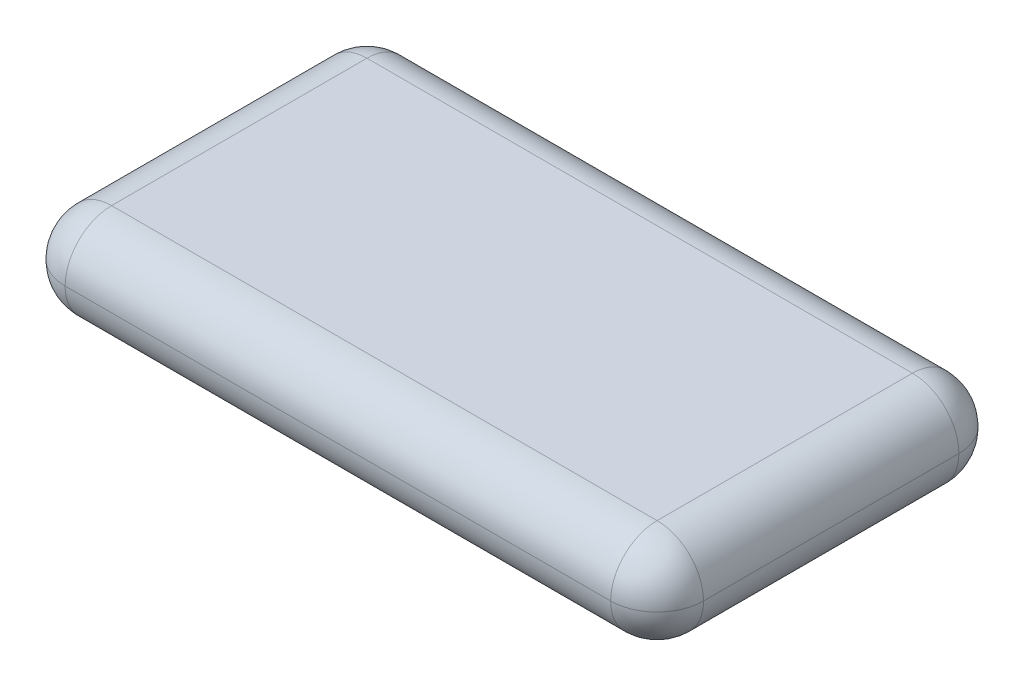
ISO-10303-21;
HEADER;
FILE_DESCRIPTION(('STEP AP214'),'2;1');
FILE_NAME('part.step','',(''),(''),'','','');
FILE_SCHEMA(('AUTOMOTIVE_DESIGN { 1 0 10303 214 1 1 1 1 }'));
ENDSEC;
DATA;
#1=APPLICATION_CONTEXT('core data for automotive mechanical design processes');
#2=APPLICATION_PROTOCOL_DEFINITION('international standard','automotive_design',2000,#1);
#3=PRODUCT_CONTEXT('',#1,'mechanical');
#4=PRODUCT('Part','Part','',(#3));
#5=PRODUCT_RELATED_PRODUCT_CATEGORY('part','',(#4));
#6=PRODUCT_DEFINITION_FORMATION('','',#4);
#7=PRODUCT_DEFINITION_CONTEXT('part definition',#1,'design');
#8=PRODUCT_DEFINITION('design','',#6,#7);
#9=PRODUCT_DEFINITION_SHAPE('','',#8);
#10=(LENGTH_UNIT() NAMED_UNIT(*) SI_UNIT(.MILLI.,.METRE.));
#11=(NAMED_UNIT(*) PLANE_ANGLE_UNIT() SI_UNIT($,.RADIAN.));
#12=(NAMED_UNIT(*) SI_UNIT($,.STERADIAN.) SOLID_ANGLE_UNIT());
#13=UNCERTAINTY_MEASURE_WITH_UNIT(LENGTH_MEASURE(1.E-05),#10,'distance_accuracy_value','');
#14=(GEOMETRIC_REPRESENTATION_CONTEXT(3) GLOBAL_UNCERTAINTY_ASSIGNED_CONTEXT((#13)) GLOBAL_UNIT_ASSIGNED_CONTEXT((#10,
#11,#12)) REPRESENTATION_CONTEXT('',''));
#15=CARTESIAN_POINT('',(0.,0.,0.));
#16=DIRECTION('',(0.,0.,1.));
#17=DIRECTION('',(1.,0.,0.));
#18=AXIS2_PLACEMENT_3D('',#15,#16,#17);
#19=CARTESIAN_POINT('',(0.,80.,0.));
#20=DIRECTION('',(0.,1.,0.));
#21=DIRECTION('',(0.,0.,1.));
#22=AXIS2_PLACEMENT_3D('',#19,#20,#21);
#23=PLANE('',#22);
#24=DIRECTION('',(0.,0.,1.));
#25=VECTOR('',#24,1.);
#26=CARTESIAN_POINT('',(-235.,80.,150.));
#27=LINE('',#26,#25);
#28=CARTESIAN_POINT('',(-235.,80.,-110.));
#29=VERTEX_POINT('',#28);
#30=CARTESIAN_POINT('',(-235.,80.,110.));
#31=VERTEX_POINT('',#30);
#32=EDGE_CURVE('E128',#29,#31,#27,.T.);
#33=ORIENTED_EDGE('',*,*,#32,.T.);
#34=DIRECTION('',(1.,0.,0.));
#35=VECTOR('',#34,1.);
#36=CARTESIAN_POINT('',(275.,80.,110.));
#37=LINE('',#36,#35);
#38=CARTESIAN_POINT('',(235.,80.,110.));
#39=VERTEX_POINT('',#38);
#40=EDGE_CURVE('E106',#31,#39,#37,.T.);
#41=ORIENTED_EDGE('',*,*,#40,.T.);
#42=DIRECTION('',(0.,0.,-1.));
#43=VECTOR('',#42,1.);
#44=CARTESIAN_POINT('',(235.,80.,-150.));
#45=LINE('',#44,#43);
#46=CARTESIAN_POINT('',(235.,80.,-110.));
#47=VERTEX_POINT('',#46);
#48=EDGE_CURVE('E117',#39,#47,#45,.T.);
#49=ORIENTED_EDGE('',*,*,#48,.T.);
#50=DIRECTION('',(-1.,0.,0.));
#51=VECTOR('',#50,1.);
#52=CARTESIAN_POINT('',(-275.,80.,-110.));
#53=LINE('',#52,#51);
#54=EDGE_CURVE('E123',#47,#29,#53,.T.);
#55=ORIENTED_EDGE('',*,*,#54,.T.);
#56=EDGE_LOOP('',(#33,#41,#49,#55));
#57=FACE_BOUND('',#56,.T.);
#58=ADVANCED_FACE('F35',(#57),#23,.T.);
#59=CARTESIAN_POINT('',(0.,0.,0.));
#60=DIRECTION('',(0.,1.,0.));
#61=DIRECTION('',(0.,0.,1.));
#62=AXIS2_PLACEMENT_3D('',#59,#60,#61);
#63=PLANE('',#62);
#64=DIRECTION('',(1.,0.,0.));
#65=VECTOR('',#64,1.);
#66=CARTESIAN_POINT('',(0.,0.,110.));
#67=LINE('',#66,#65);
#68=CARTESIAN_POINT('',(235.,0.,110.));
#69=VERTEX_POINT('',#68);
#70=CARTESIAN_POINT('',(-235.,0.,110.));
#71=VERTEX_POINT('',#70);
#72=EDGE_CURVE('E129',#69,#71,#67,.F.);
#73=ORIENTED_EDGE('',*,*,#72,.T.);
#74=DIRECTION('',(0.,0.,1.));
#75=VECTOR('',#74,1.);
#76=CARTESIAN_POINT('',(-235.,0.,0.));
#77=LINE('',#76,#75);
#78=CARTESIAN_POINT('',(-235.,0.,-110.));
#79=VERTEX_POINT('',#78);
#80=EDGE_CURVE('E151',#71,#79,#77,.F.);
#81=ORIENTED_EDGE('',*,*,#80,.T.);
#82=DIRECTION('',(-1.,0.,0.));
#83=VECTOR('',#82,1.);
#84=CARTESIAN_POINT('',(0.,0.,-110.));
#85=LINE('',#84,#83);
#86=CARTESIAN_POINT('',(235.,0.,-110.));
#87=VERTEX_POINT('',#86);
#88=EDGE_CURVE('E186',#79,#87,#85,.F.);
#89=ORIENTED_EDGE('',*,*,#88,.T.);
#90=DIRECTION('',(0.,0.,-1.));
#91=VECTOR('',#90,1.);
#92=CARTESIAN_POINT('',(235.,0.,0.));
#93=LINE('',#92,#91);
#94=EDGE_CURVE('E188',#87,#69,#93,.F.);
#95=ORIENTED_EDGE('',*,*,#94,.T.);
#96=EDGE_LOOP('',(#73,#81,#89,#95));
#97=FACE_BOUND('',#96,.T.);
#98=ADVANCED_FACE('F215',(#97),#63,.F.);
#99=CARTESIAN_POINT('',(-275.,40.,-110.));
#100=DIRECTION('',(-1.,0.,0.));
#101=DIRECTION('',(0.,0.,1.));
#102=AXIS2_PLACEMENT_3D('',#99,#100,#101);
#103=CYLINDRICAL_SURFACE('',#102,40.);
#104=CARTESIAN_POINT('',(-235.,40.,-110.));
#105=DIRECTION('',(-1.,0.,0.));
#106=DIRECTION('',(0.,0.,1.));
#107=AXIS2_PLACEMENT_3D('',#104,#105,#106);
#108=CIRCLE('',#107,40.);
#109=CARTESIAN_POINT('',(-235.,40.,-150.));
#110=VERTEX_POINT('',#109);
#111=EDGE_CURVE('E124',#110,#79,#108,.T.);
#112=ORIENTED_EDGE('',*,*,#111,.F.);
#113=DIRECTION('',(-1.,0.,0.));
#114=VECTOR('',#113,1.);
#115=CARTESIAN_POINT('',(-275.,40.,-150.));
#116=LINE('',#115,#114);
#117=CARTESIAN_POINT('',(235.,40.,-150.));
#118=VERTEX_POINT('',#117);
#119=EDGE_CURVE('E157',#118,#110,#116,.T.);
#120=ORIENTED_EDGE('',*,*,#119,.F.);
#121=CARTESIAN_POINT('',(235.,40.,-110.));
#122=DIRECTION('',(1.,0.,0.));
#123=DIRECTION('',(0.,0.,-1.));
#124=AXIS2_PLACEMENT_3D('',#121,#122,#123);
#125=CIRCLE('',#124,40.);
#126=EDGE_CURVE('E160',#87,#118,#125,.T.);
#127=ORIENTED_EDGE('',*,*,#126,.F.);
#128=ORIENTED_EDGE('',*,*,#88,.F.);
#129=EDGE_LOOP('',(#112,#120,#127,#128));
#130=FACE_BOUND('',#129,.T.);
#131=ADVANCED_FACE('F220',(#130),#103,.T.);
#132=CARTESIAN_POINT('',(-235.,40.,-110.));
#133=DIRECTION('',(0.,0.,1.));
#134=DIRECTION('',(1.,0.,0.));
#135=AXIS2_PLACEMENT_3D('',#132,#133,#134);
#136=SPHERICAL_SURFACE('',#135,40.);
#137=CARTESIAN_POINT('',(-235.,40.,-110.));
#138=DIRECTION('',(0.,-1.,0.));
#139=DIRECTION('',(0.,0.,-1.));
#140=AXIS2_PLACEMENT_3D('',#137,#138,#139);
#141=CIRCLE('',#140,40.);
#142=CARTESIAN_POINT('',(-275.,40.,-110.));
#143=VERTEX_POINT('',#142);
#144=EDGE_CURVE('E154',#110,#143,#141,.F.);
#145=ORIENTED_EDGE('',*,*,#144,.F.);
#146=ORIENTED_EDGE('',*,*,#111,.T.);
#147=CARTESIAN_POINT('',(-235.,40.,-110.));
#148=DIRECTION('',(0.,0.,-1.));
#149=DIRECTION('',(-1.,0.,0.));
#150=AXIS2_PLACEMENT_3D('',#147,#148,#149);
#151=CIRCLE('',#150,40.);
#152=EDGE_CURVE('E163',#143,#79,#151,.F.);
#153=ORIENTED_EDGE('',*,*,#152,.F.);
#154=EDGE_LOOP('',(#145,#146,#153));
#155=FACE_BOUND('',#154,.T.);
#156=ADVANCED_FACE('F348',(#155),#136,.T.);
#157=CARTESIAN_POINT('',(0.,40.,-110.));
#158=DIRECTION('',(1.,0.,0.));
#159=DIRECTION('',(0.,0.,-1.));
#160=AXIS2_PLACEMENT_3D('',#157,#158,#159);
#161=CYLINDRICAL_SURFACE('',#160,40.);
#162=CARTESIAN_POINT('',(235.,40.,-110.));
#163=DIRECTION('',(1.,0.,0.));
#164=DIRECTION('',(0.,1.,0.));
#165=AXIS2_PLACEMENT_3D('',#162,#163,#164);
#166=CIRCLE('',#165,40.);
#167=EDGE_CURVE('E168',#118,#47,#166,.T.);
#168=ORIENTED_EDGE('',*,*,#167,.F.);
#169=ORIENTED_EDGE('',*,*,#119,.T.);
#170=CARTESIAN_POINT('',(-235.,40.,-110.));
#171=DIRECTION('',(-1.,0.,0.));
#172=DIRECTION('',(0.,0.,1.));
#173=AXIS2_PLACEMENT_3D('',#170,#171,#172);
#174=CIRCLE('',#173,40.);
#175=EDGE_CURVE('E165',#29,#110,#174,.T.);
#176=ORIENTED_EDGE('',*,*,#175,.F.);
#177=ORIENTED_EDGE('',*,*,#54,.F.);
#178=EDGE_LOOP('',(#168,#169,#176,#177));
#179=FACE_BOUND('',#178,.T.);
#180=ADVANCED_FACE('F198',(#179),#161,.T.);
#181=CARTESIAN_POINT('',(235.,40.,-110.));
#182=DIRECTION('',(0.,0.,1.));
#183=DIRECTION('',(1.,0.,0.));
#184=AXIS2_PLACEMENT_3D('',#181,#182,#183);
#185=SPHERICAL_SURFACE('',#184,40.);
#186=ORIENTED_EDGE('',*,*,#126,.T.);
#187=CARTESIAN_POINT('',(235.,40.,-110.));
#188=DIRECTION('',(0.,1.,0.));
#189=DIRECTION('',(0.,0.,1.));
#190=AXIS2_PLACEMENT_3D('',#187,#188,#189);
#191=CIRCLE('',#190,40.);
#192=CARTESIAN_POINT('',(275.,40.,-110.));
#193=VERTEX_POINT('',#192);
#194=EDGE_CURVE('E171',#193,#118,#191,.T.);
#195=ORIENTED_EDGE('',*,*,#194,.F.);
#196=CARTESIAN_POINT('',(235.,40.,-110.));
#197=DIRECTION('',(0.,0.,-1.));
#198=DIRECTION('',(-1.,0.,0.));
#199=AXIS2_PLACEMENT_3D('',#196,#197,#198);
#200=CIRCLE('',#199,40.);
#201=EDGE_CURVE('E174',#87,#193,#200,.F.);
#202=ORIENTED_EDGE('',*,*,#201,.F.);
#203=EDGE_LOOP('',(#186,#195,#202));
#204=FACE_BOUND('',#203,.T.);
#205=ADVANCED_FACE('F223',(#204),#185,.T.);
#206=CARTESIAN_POINT('',(-235.,40.,-150.));
#207=DIRECTION('',(0.,0.,1.));
#208=DIRECTION('',(1.,0.,0.));
#209=AXIS2_PLACEMENT_3D('',#206,#207,#208);
#210=CYLINDRICAL_SURFACE('',#209,40.);
#211=ORIENTED_EDGE('',*,*,#80,.F.);
#212=CARTESIAN_POINT('',(-235.,40.,110.));
#213=DIRECTION('',(0.,0.,1.));
#214=DIRECTION('',(1.,0.,0.));
#215=AXIS2_PLACEMENT_3D('',#212,#213,#214);
#216=CIRCLE('',#215,40.);
#217=CARTESIAN_POINT('',(-275.,40.,110.));
#218=VERTEX_POINT('',#217);
#219=EDGE_CURVE('E58',#71,#218,#216,.F.);
#220=ORIENTED_EDGE('',*,*,#219,.T.);
#221=DIRECTION('',(0.,0.,1.));
#222=VECTOR('',#221,1.);
#223=CARTESIAN_POINT('',(-275.,40.,-150.));
#224=LINE('',#223,#222);
#225=EDGE_CURVE('E177',#143,#218,#224,.T.);
#226=ORIENTED_EDGE('',*,*,#225,.F.);
#227=ORIENTED_EDGE('',*,*,#152,.T.);
#228=EDGE_LOOP('',(#211,#220,#226,#227));
#229=FACE_BOUND('',#228,.T.);
#230=ADVANCED_FACE('F233',(#229),#210,.T.);
#231=CARTESIAN_POINT('',(-235.,40.,-110.));
#232=DIRECTION('',(0.,0.,1.));
#233=DIRECTION('',(1.,0.,0.));
#234=AXIS2_PLACEMENT_3D('',#231,#232,#233);
#235=SPHERICAL_SURFACE('',#234,40.);
#236=ORIENTED_EDGE('',*,*,#175,.T.);
#237=ORIENTED_EDGE('',*,*,#144,.T.);
#238=CARTESIAN_POINT('',(-235.,40.,-110.));
#239=DIRECTION('',(0.,0.,-1.));
#240=DIRECTION('',(-1.,0.,0.));
#241=AXIS2_PLACEMENT_3D('',#238,#239,#240);
#242=CIRCLE('',#241,40.);
#243=EDGE_CURVE('E179',#29,#143,#242,.F.);
#244=ORIENTED_EDGE('',*,*,#243,.F.);
#245=EDGE_LOOP('',(#236,#237,#244));
#246=FACE_BOUND('',#245,.T.);
#247=ADVANCED_FACE('F200',(#246),#235,.T.);
#248=CARTESIAN_POINT('',(235.,40.,-110.));
#249=DIRECTION('',(0.,0.,1.));
#250=DIRECTION('',(1.,0.,0.));
#251=AXIS2_PLACEMENT_3D('',#248,#249,#250);
#252=SPHERICAL_SURFACE('',#251,40.);
#253=ORIENTED_EDGE('',*,*,#194,.T.);
#254=ORIENTED_EDGE('',*,*,#167,.T.);
#255=CARTESIAN_POINT('',(235.,40.,-110.));
#256=DIRECTION('',(0.,0.,-1.));
#257=DIRECTION('',(-1.,0.,0.));
#258=AXIS2_PLACEMENT_3D('',#255,#256,#257);
#259=CIRCLE('',#258,40.);
#260=EDGE_CURVE('E120',#193,#47,#259,.F.);
#261=ORIENTED_EDGE('',*,*,#260,.F.);
#262=EDGE_LOOP('',(#253,#254,#261));
#263=FACE_BOUND('',#262,.T.);
#264=ADVANCED_FACE('F225',(#263),#252,.T.);
#265=CARTESIAN_POINT('',(235.,40.,-150.));
#266=DIRECTION('',(0.,0.,-1.));
#267=DIRECTION('',(-1.,0.,0.));
#268=AXIS2_PLACEMENT_3D('',#265,#266,#267);
#269=CYLINDRICAL_SURFACE('',#268,40.);
#270=DIRECTION('',(0.,0.,-1.));
#271=VECTOR('',#270,1.);
#272=CARTESIAN_POINT('',(275.,40.,-150.));
#273=LINE('',#272,#271);
#274=CARTESIAN_POINT('',(275.,40.,110.));
#275=VERTEX_POINT('',#274);
#276=EDGE_CURVE('E139',#275,#193,#273,.T.);
#277=ORIENTED_EDGE('',*,*,#276,.F.);
#278=CARTESIAN_POINT('',(235.,40.,110.));
#279=DIRECTION('',(0.,0.,-1.));
#280=DIRECTION('',(-1.,0.,0.));
#281=AXIS2_PLACEMENT_3D('',#278,#279,#280);
#282=CIRCLE('',#281,40.);
#283=EDGE_CURVE('E114',#275,#69,#282,.T.);
#284=ORIENTED_EDGE('',*,*,#283,.T.);
#285=ORIENTED_EDGE('',*,*,#94,.F.);
#286=ORIENTED_EDGE('',*,*,#201,.T.);
#287=EDGE_LOOP('',(#277,#284,#285,#286));
#288=FACE_BOUND('',#287,.T.);
#289=ADVANCED_FACE('F213',(#288),#269,.T.);
#290=CARTESIAN_POINT('',(-275.,40.,110.));
#291=DIRECTION('',(1.,0.,0.));
#292=DIRECTION('',(0.,0.,-1.));
#293=AXIS2_PLACEMENT_3D('',#290,#291,#292);
#294=CYLINDRICAL_SURFACE('',#293,40.);
#295=DIRECTION('',(1.,0.,0.));
#296=VECTOR('',#295,1.);
#297=CARTESIAN_POINT('',(-275.,40.,150.));
#298=LINE('',#297,#296);
#299=CARTESIAN_POINT('',(-235.,40.,150.));
#300=VERTEX_POINT('',#299);
#301=CARTESIAN_POINT('',(235.,40.,150.));
#302=VERTEX_POINT('',#301);
#303=EDGE_CURVE('E109',#300,#302,#298,.T.);
#304=ORIENTED_EDGE('',*,*,#303,.F.);
#305=CARTESIAN_POINT('',(-235.,40.,110.));
#306=DIRECTION('',(1.,0.,0.));
#307=DIRECTION('',(0.,0.,-1.));
#308=AXIS2_PLACEMENT_3D('',#305,#306,#307);
#309=CIRCLE('',#308,40.);
#310=EDGE_CURVE('E146',#300,#71,#309,.T.);
#311=ORIENTED_EDGE('',*,*,#310,.T.);
#312=ORIENTED_EDGE('',*,*,#72,.F.);
#313=CARTESIAN_POINT('',(235.,40.,110.));
#314=DIRECTION('',(1.,0.,0.));
#315=DIRECTION('',(0.,0.,-1.));
#316=AXIS2_PLACEMENT_3D('',#313,#314,#315);
#317=CIRCLE('',#316,40.);
#318=EDGE_CURVE('E149',#69,#302,#317,.F.);
#319=ORIENTED_EDGE('',*,*,#318,.T.);
#320=EDGE_LOOP('',(#304,#311,#312,#319));
#321=FACE_BOUND('',#320,.T.);
#322=ADVANCED_FACE('F208',(#321),#294,.T.);
#323=CARTESIAN_POINT('',(-235.,40.,0.));
#324=DIRECTION('',(0.,0.,-1.));
#325=DIRECTION('',(-1.,0.,0.));
#326=AXIS2_PLACEMENT_3D('',#323,#324,#325);
#327=CYLINDRICAL_SURFACE('',#326,40.);
#328=ORIENTED_EDGE('',*,*,#225,.T.);
#329=CARTESIAN_POINT('',(-235.,40.,110.));
#330=DIRECTION('',(0.,0.,-1.));
#331=DIRECTION('',(-1.,0.,0.));
#332=AXIS2_PLACEMENT_3D('',#329,#330,#331);
#333=CIRCLE('',#332,40.);
#334=EDGE_CURVE('E44',#218,#31,#333,.T.);
#335=ORIENTED_EDGE('',*,*,#334,.T.);
#336=ORIENTED_EDGE('',*,*,#32,.F.);
#337=ORIENTED_EDGE('',*,*,#243,.T.);
#338=EDGE_LOOP('',(#328,#335,#336,#337));
#339=FACE_BOUND('',#338,.T.);
#340=ADVANCED_FACE('F203',(#339),#327,.T.);
#341=CARTESIAN_POINT('',(235.,40.,0.));
#342=DIRECTION('',(0.,0.,1.));
#343=DIRECTION('',(1.,0.,0.));
#344=AXIS2_PLACEMENT_3D('',#341,#342,#343);
#345=CYLINDRICAL_SURFACE('',#344,40.);
#346=ORIENTED_EDGE('',*,*,#48,.F.);
#347=CARTESIAN_POINT('',(235.,40.,110.));
#348=DIRECTION('',(0.,0.,1.));
#349=DIRECTION('',(1.,0.,0.));
#350=AXIS2_PLACEMENT_3D('',#347,#348,#349);
#351=CIRCLE('',#350,40.);
#352=EDGE_CURVE('E11',#39,#275,#351,.F.);
#353=ORIENTED_EDGE('',*,*,#352,.T.);
#354=ORIENTED_EDGE('',*,*,#276,.T.);
#355=ORIENTED_EDGE('',*,*,#260,.T.);
#356=EDGE_LOOP('',(#346,#353,#354,#355));
#357=FACE_BOUND('',#356,.T.);
#358=ADVANCED_FACE('F118',(#357),#345,.T.);
#359=CARTESIAN_POINT('',(0.,40.,110.));
#360=DIRECTION('',(-1.,0.,0.));
#361=DIRECTION('',(0.,0.,1.));
#362=AXIS2_PLACEMENT_3D('',#359,#360,#361);
#363=CYLINDRICAL_SURFACE('',#362,40.);
#364=ORIENTED_EDGE('',*,*,#40,.F.);
#365=CARTESIAN_POINT('',(-235.,40.,110.));
#366=DIRECTION('',(-1.,0.,0.));
#367=DIRECTION('',(0.,0.,1.));
#368=AXIS2_PLACEMENT_3D('',#365,#366,#367);
#369=CIRCLE('',#368,40.);
#370=EDGE_CURVE('E113',#31,#300,#369,.F.);
#371=ORIENTED_EDGE('',*,*,#370,.T.);
#372=ORIENTED_EDGE('',*,*,#303,.T.);
#373=CARTESIAN_POINT('',(235.,40.,110.));
#374=DIRECTION('',(-1.,0.,0.));
#375=DIRECTION('',(0.,0.,1.));
#376=AXIS2_PLACEMENT_3D('',#373,#374,#375);
#377=CIRCLE('',#376,40.);
#378=EDGE_CURVE('E103',#302,#39,#377,.T.);
#379=ORIENTED_EDGE('',*,*,#378,.T.);
#380=EDGE_LOOP('',(#364,#371,#372,#379));
#381=FACE_BOUND('',#380,.T.);
#382=ADVANCED_FACE('F104',(#381),#363,.T.);
#383=CARTESIAN_POINT('',(-235.,40.,110.));
#384=DIRECTION('',(0.,0.,1.));
#385=DIRECTION('',(1.,0.,0.));
#386=AXIS2_PLACEMENT_3D('',#383,#384,#385);
#387=SPHERICAL_SURFACE('',#386,40.);
#388=ORIENTED_EDGE('',*,*,#370,.F.);
#389=ORIENTED_EDGE('',*,*,#334,.F.);
#390=CARTESIAN_POINT('',(-235.,40.,110.));
#391=DIRECTION('',(0.,-1.,0.));
#392=DIRECTION('',(0.,0.,-1.));
#393=AXIS2_PLACEMENT_3D('',#390,#391,#392);
#394=CIRCLE('',#393,40.);
#395=EDGE_CURVE('E134',#300,#218,#394,.T.);
#396=ORIENTED_EDGE('',*,*,#395,.F.);
#397=EDGE_LOOP('',(#388,#389,#396));
#398=FACE_BOUND('',#397,.T.);
#399=ADVANCED_FACE('F206',(#398),#387,.T.);
#400=CARTESIAN_POINT('',(-235.,40.,110.));
#401=DIRECTION('',(0.,0.,1.));
#402=DIRECTION('',(1.,0.,0.));
#403=AXIS2_PLACEMENT_3D('',#400,#401,#402);
#404=SPHERICAL_SURFACE('',#403,40.);
#405=ORIENTED_EDGE('',*,*,#395,.T.);
#406=ORIENTED_EDGE('',*,*,#219,.F.);
#407=ORIENTED_EDGE('',*,*,#310,.F.);
#408=EDGE_LOOP('',(#405,#406,#407));
#409=FACE_BOUND('',#408,.T.);
#410=ADVANCED_FACE('F271',(#409),#404,.T.);
#411=CARTESIAN_POINT('',(235.,40.,110.));
#412=DIRECTION('',(0.,0.,1.));
#413=DIRECTION('',(1.,0.,0.));
#414=AXIS2_PLACEMENT_3D('',#411,#412,#413);
#415=SPHERICAL_SURFACE('',#414,40.);
#416=ORIENTED_EDGE('',*,*,#352,.F.);
#417=ORIENTED_EDGE('',*,*,#378,.F.);
#418=CARTESIAN_POINT('',(235.,40.,110.));
#419=DIRECTION('',(0.,-1.,0.));
#420=DIRECTION('',(0.,0.,-1.));
#421=AXIS2_PLACEMENT_3D('',#418,#419,#420);
#422=CIRCLE('',#421,40.);
#423=EDGE_CURVE('E39',#275,#302,#422,.T.);
#424=ORIENTED_EDGE('',*,*,#423,.F.);
#425=EDGE_LOOP('',(#416,#417,#424));
#426=FACE_BOUND('',#425,.T.);
#427=ADVANCED_FACE('F37',(#426),#415,.T.);
#428=CARTESIAN_POINT('',(235.,40.,110.));
#429=DIRECTION('',(0.,0.,1.));
#430=DIRECTION('',(1.,0.,0.));
#431=AXIS2_PLACEMENT_3D('',#428,#429,#430);
#432=SPHERICAL_SURFACE('',#431,40.);
#433=ORIENTED_EDGE('',*,*,#318,.F.);
#434=ORIENTED_EDGE('',*,*,#283,.F.);
#435=ORIENTED_EDGE('',*,*,#423,.T.);
#436=EDGE_LOOP('',(#433,#434,#435));
#437=FACE_BOUND('',#436,.T.);
#438=ADVANCED_FACE('F210',(#437),#432,.T.);
#439=CLOSED_SHELL('',(#58,#98,#131,#156,#180,#205,#230,#247,#264,#289,#322,#340,#358,#382,#399,
#410,#427,#438));
#440=MANIFOLD_SOLID_BREP('B2',#439);
#441=ADVANCED_BREP_SHAPE_REPRESENTATION('',(#18,#440),#14);
#442=SHAPE_DEFINITION_REPRESENTATION(#9,#441);
ENDSEC;
END-ISO-10303-21;
